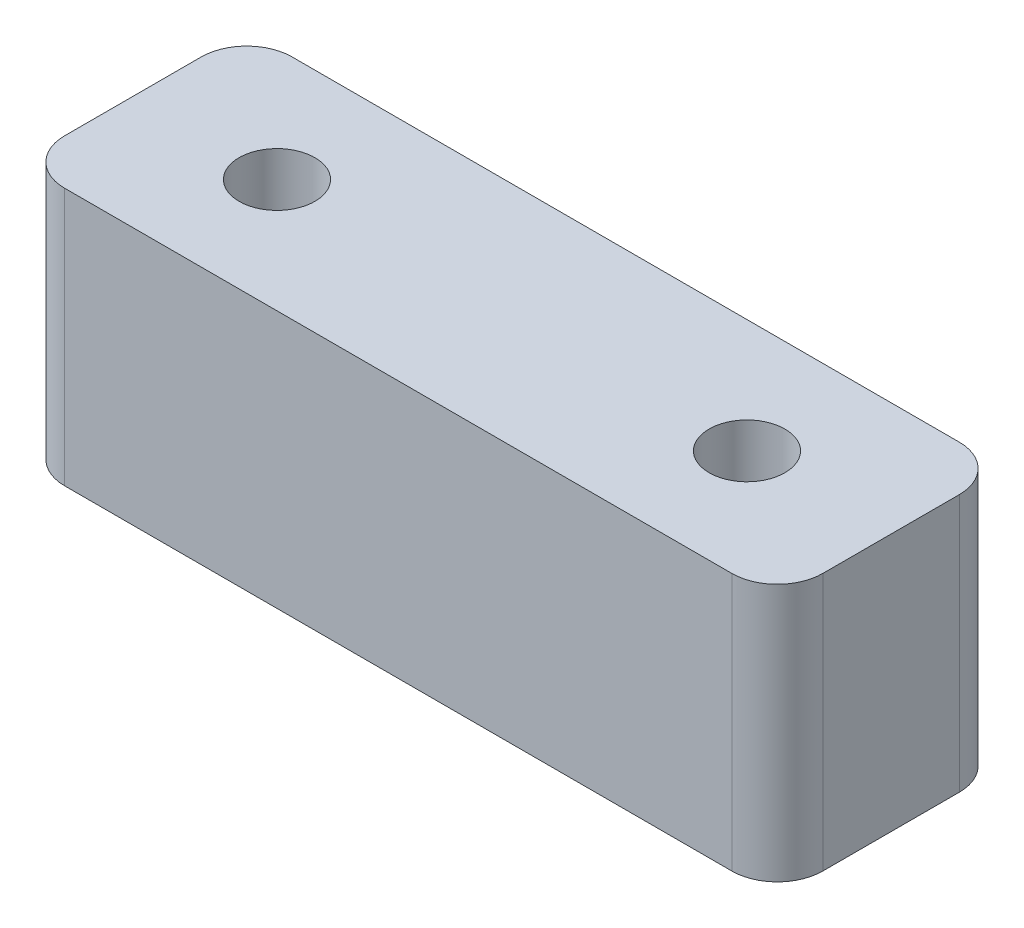
ISO-10303-21;
HEADER;
FILE_DESCRIPTION(('STEP AP214'),'2;1');
FILE_NAME('part.step','',(''),(''),'','','');
FILE_SCHEMA(('AUTOMOTIVE_DESIGN { 1 0 10303 214 1 1 1 1 }'));
ENDSEC;
DATA;
#1=APPLICATION_CONTEXT('core data for automotive mechanical design processes');
#2=APPLICATION_PROTOCOL_DEFINITION('international standard','automotive_design',2000,#1);
#3=PRODUCT_CONTEXT('',#1,'mechanical');
#4=PRODUCT('Part','Part','',(#3));
#5=PRODUCT_RELATED_PRODUCT_CATEGORY('part','',(#4));
#6=PRODUCT_DEFINITION_FORMATION('','',#4);
#7=PRODUCT_DEFINITION_CONTEXT('part definition',#1,'design');
#8=PRODUCT_DEFINITION('design','',#6,#7);
#9=PRODUCT_DEFINITION_SHAPE('','',#8);
#10=(LENGTH_UNIT() NAMED_UNIT(*) SI_UNIT(.MILLI.,.METRE.));
#11=(NAMED_UNIT(*) PLANE_ANGLE_UNIT() SI_UNIT($,.RADIAN.));
#12=(NAMED_UNIT(*) SI_UNIT($,.STERADIAN.) SOLID_ANGLE_UNIT());
#13=UNCERTAINTY_MEASURE_WITH_UNIT(LENGTH_MEASURE(1.E-05),#10,'distance_accuracy_value','');
#14=(GEOMETRIC_REPRESENTATION_CONTEXT(3) GLOBAL_UNCERTAINTY_ASSIGNED_CONTEXT((#13)) GLOBAL_UNIT_ASSIGNED_CONTEXT((#10,
#11,#12)) REPRESENTATION_CONTEXT('',''));
#15=CARTESIAN_POINT('',(0.,0.,0.));
#16=DIRECTION('',(0.,0.,1.));
#17=DIRECTION('',(1.,0.,0.));
#18=AXIS2_PLACEMENT_3D('',#15,#16,#17);
#19=CARTESIAN_POINT('',(3.,17.,-3.));
#20=DIRECTION('',(0.,1.,0.));
#21=DIRECTION('',(0.,0.,1.));
#22=AXIS2_PLACEMENT_3D('',#19,#20,#21);
#23=CYLINDRICAL_SURFACE('',#22,3.);
#24=DIRECTION('',(0.,1.,0.));
#25=VECTOR('',#24,1.);
#26=CARTESIAN_POINT('',(0.,17.,-3.));
#27=LINE('',#26,#25);
#28=CARTESIAN_POINT('',(0.,0.,-3.));
#29=VERTEX_POINT('',#28);
#30=CARTESIAN_POINT('',(0.,17.,-3.));
#31=VERTEX_POINT('',#30);
#32=EDGE_CURVE('E147',#29,#31,#27,.T.);
#33=ORIENTED_EDGE('',*,*,#32,.F.);
#34=CARTESIAN_POINT('',(3.,0.,-3.));
#35=DIRECTION('',(0.,-1.,0.));
#36=DIRECTION('',(0.,0.,-1.));
#37=AXIS2_PLACEMENT_3D('',#34,#35,#36);
#38=CIRCLE('',#37,3.);
#39=CARTESIAN_POINT('',(3.,0.,0.));
#40=VERTEX_POINT('',#39);
#41=EDGE_CURVE('E39',#40,#29,#38,.T.);
#42=ORIENTED_EDGE('',*,*,#41,.F.);
#43=DIRECTION('',(0.,1.,0.));
#44=VECTOR('',#43,1.);
#45=CARTESIAN_POINT('',(3.,17.,0.));
#46=LINE('',#45,#44);
#47=CARTESIAN_POINT('',(3.,17.,0.));
#48=VERTEX_POINT('',#47);
#49=EDGE_CURVE('E99',#48,#40,#46,.F.);
#50=ORIENTED_EDGE('',*,*,#49,.F.);
#51=CARTESIAN_POINT('',(3.,17.,-3.));
#52=DIRECTION('',(0.,-1.,0.));
#53=DIRECTION('',(0.,0.,-1.));
#54=AXIS2_PLACEMENT_3D('',#51,#52,#53);
#55=CIRCLE('',#54,3.);
#56=EDGE_CURVE('E11',#31,#48,#55,.F.);
#57=ORIENTED_EDGE('',*,*,#56,.F.);
#58=EDGE_LOOP('',(#33,#42,#50,#57));
#59=FACE_BOUND('',#58,.T.);
#60=ADVANCED_FACE('F32',(#59),#23,.T.);
#61=CARTESIAN_POINT('',(3.,17.,-12.));
#62=DIRECTION('',(0.,1.,0.));
#63=DIRECTION('',(0.,0.,1.));
#64=AXIS2_PLACEMENT_3D('',#61,#62,#63);
#65=CYLINDRICAL_SURFACE('',#64,3.);
#66=DIRECTION('',(0.,1.,0.));
#67=VECTOR('',#66,1.);
#68=CARTESIAN_POINT('',(3.,17.,-15.));
#69=LINE('',#68,#67);
#70=CARTESIAN_POINT('',(3.,0.,-15.));
#71=VERTEX_POINT('',#70);
#72=CARTESIAN_POINT('',(3.,17.,-15.));
#73=VERTEX_POINT('',#72);
#74=EDGE_CURVE('E137',#71,#73,#69,.T.);
#75=ORIENTED_EDGE('',*,*,#74,.F.);
#76=CARTESIAN_POINT('',(3.,0.,-12.));
#77=DIRECTION('',(0.,-1.,0.));
#78=DIRECTION('',(0.,0.,-1.));
#79=AXIS2_PLACEMENT_3D('',#76,#77,#78);
#80=CIRCLE('',#79,3.);
#81=CARTESIAN_POINT('',(0.,0.,-12.));
#82=VERTEX_POINT('',#81);
#83=EDGE_CURVE('E143',#82,#71,#80,.T.);
#84=ORIENTED_EDGE('',*,*,#83,.F.);
#85=DIRECTION('',(0.,1.,0.));
#86=VECTOR('',#85,1.);
#87=CARTESIAN_POINT('',(0.,17.,-12.));
#88=LINE('',#87,#86);
#89=CARTESIAN_POINT('',(0.,17.,-12.));
#90=VERTEX_POINT('',#89);
#91=EDGE_CURVE('E140',#90,#82,#88,.F.);
#92=ORIENTED_EDGE('',*,*,#91,.F.);
#93=CARTESIAN_POINT('',(3.,17.,-12.));
#94=DIRECTION('',(0.,-1.,0.));
#95=DIRECTION('',(0.,0.,-1.));
#96=AXIS2_PLACEMENT_3D('',#93,#94,#95);
#97=CIRCLE('',#96,3.);
#98=EDGE_CURVE('E145',#73,#90,#97,.F.);
#99=ORIENTED_EDGE('',*,*,#98,.F.);
#100=EDGE_LOOP('',(#75,#84,#92,#99));
#101=FACE_BOUND('',#100,.T.);
#102=ADVANCED_FACE('F183',(#101),#65,.T.);
#103=CARTESIAN_POINT('',(47.,17.,-12.));
#104=DIRECTION('',(0.,1.,0.));
#105=DIRECTION('',(0.,0.,1.));
#106=AXIS2_PLACEMENT_3D('',#103,#104,#105);
#107=CYLINDRICAL_SURFACE('',#106,3.);
#108=DIRECTION('',(0.,1.,0.));
#109=VECTOR('',#108,1.);
#110=CARTESIAN_POINT('',(50.,17.,-12.));
#111=LINE('',#110,#109);
#112=CARTESIAN_POINT('',(50.,0.,-12.));
#113=VERTEX_POINT('',#112);
#114=CARTESIAN_POINT('',(50.,17.,-12.));
#115=VERTEX_POINT('',#114);
#116=EDGE_CURVE('E127',#113,#115,#111,.T.);
#117=ORIENTED_EDGE('',*,*,#116,.F.);
#118=CARTESIAN_POINT('',(47.,0.,-12.));
#119=DIRECTION('',(0.,-1.,0.));
#120=DIRECTION('',(0.,0.,-1.));
#121=AXIS2_PLACEMENT_3D('',#118,#119,#120);
#122=CIRCLE('',#121,3.);
#123=CARTESIAN_POINT('',(47.,0.,-15.));
#124=VERTEX_POINT('',#123);
#125=EDGE_CURVE('E133',#124,#113,#122,.T.);
#126=ORIENTED_EDGE('',*,*,#125,.F.);
#127=DIRECTION('',(0.,1.,0.));
#128=VECTOR('',#127,1.);
#129=CARTESIAN_POINT('',(47.,17.,-15.));
#130=LINE('',#129,#128);
#131=CARTESIAN_POINT('',(47.,17.,-15.));
#132=VERTEX_POINT('',#131);
#133=EDGE_CURVE('E130',#132,#124,#130,.F.);
#134=ORIENTED_EDGE('',*,*,#133,.F.);
#135=CARTESIAN_POINT('',(47.,17.,-12.));
#136=DIRECTION('',(0.,-1.,0.));
#137=DIRECTION('',(0.,0.,-1.));
#138=AXIS2_PLACEMENT_3D('',#135,#136,#137);
#139=CIRCLE('',#138,3.);
#140=EDGE_CURVE('E135',#115,#132,#139,.F.);
#141=ORIENTED_EDGE('',*,*,#140,.F.);
#142=EDGE_LOOP('',(#117,#126,#134,#141));
#143=FACE_BOUND('',#142,.T.);
#144=ADVANCED_FACE('F178',(#143),#107,.T.);
#145=CARTESIAN_POINT('',(47.,17.,-3.));
#146=DIRECTION('',(0.,1.,0.));
#147=DIRECTION('',(0.,0.,1.));
#148=AXIS2_PLACEMENT_3D('',#145,#146,#147);
#149=CYLINDRICAL_SURFACE('',#148,3.);
#150=DIRECTION('',(0.,1.,0.));
#151=VECTOR('',#150,1.);
#152=CARTESIAN_POINT('',(47.,17.,0.));
#153=LINE('',#152,#151);
#154=CARTESIAN_POINT('',(47.,0.,0.));
#155=VERTEX_POINT('',#154);
#156=CARTESIAN_POINT('',(47.,17.,0.));
#157=VERTEX_POINT('',#156);
#158=EDGE_CURVE('E98',#155,#157,#153,.T.);
#159=ORIENTED_EDGE('',*,*,#158,.F.);
#160=CARTESIAN_POINT('',(47.,0.,-3.));
#161=DIRECTION('',(0.,-1.,0.));
#162=DIRECTION('',(0.,0.,-1.));
#163=AXIS2_PLACEMENT_3D('',#160,#161,#162);
#164=CIRCLE('',#163,3.);
#165=CARTESIAN_POINT('',(50.,0.,-3.));
#166=VERTEX_POINT('',#165);
#167=EDGE_CURVE('E105',#166,#155,#164,.T.);
#168=ORIENTED_EDGE('',*,*,#167,.F.);
#169=DIRECTION('',(0.,1.,0.));
#170=VECTOR('',#169,1.);
#171=CARTESIAN_POINT('',(50.,17.,-3.));
#172=LINE('',#171,#170);
#173=CARTESIAN_POINT('',(50.,17.,-3.));
#174=VERTEX_POINT('',#173);
#175=EDGE_CURVE('E112',#174,#166,#172,.F.);
#176=ORIENTED_EDGE('',*,*,#175,.F.);
#177=CARTESIAN_POINT('',(47.,17.,-3.));
#178=DIRECTION('',(0.,-1.,0.));
#179=DIRECTION('',(0.,0.,-1.));
#180=AXIS2_PLACEMENT_3D('',#177,#178,#179);
#181=CIRCLE('',#180,3.);
#182=EDGE_CURVE('E111',#157,#174,#181,.F.);
#183=ORIENTED_EDGE('',*,*,#182,.F.);
#184=EDGE_LOOP('',(#159,#168,#176,#183));
#185=FACE_BOUND('',#184,.T.);
#186=ADVANCED_FACE('F115',(#185),#149,.T.);
#187=CARTESIAN_POINT('',(0.,17.,0.));
#188=DIRECTION('',(1.,0.,0.));
#189=DIRECTION('',(0.,0.,-1.));
#190=AXIS2_PLACEMENT_3D('',#187,#188,#189);
#191=PLANE('',#190);
#192=DIRECTION('',(0.,0.,1.));
#193=VECTOR('',#192,1.);
#194=CARTESIAN_POINT('',(0.,0.,0.));
#195=LINE('',#194,#193);
#196=EDGE_CURVE('E102',#82,#29,#195,.T.);
#197=ORIENTED_EDGE('',*,*,#196,.T.);
#198=ORIENTED_EDGE('',*,*,#32,.T.);
#199=DIRECTION('',(0.,0.,1.));
#200=VECTOR('',#199,1.);
#201=CARTESIAN_POINT('',(0.,17.,0.));
#202=LINE('',#201,#200);
#203=EDGE_CURVE('E164',#90,#31,#202,.T.);
#204=ORIENTED_EDGE('',*,*,#203,.F.);
#205=ORIENTED_EDGE('',*,*,#91,.T.);
#206=EDGE_LOOP('',(#197,#198,#204,#205));
#207=FACE_BOUND('',#206,.T.);
#208=ADVANCED_FACE('F154',(#207),#191,.F.);
#209=CARTESIAN_POINT('',(0.,17.,0.));
#210=DIRECTION('',(0.,0.,-1.));
#211=DIRECTION('',(-1.,0.,0.));
#212=AXIS2_PLACEMENT_3D('',#209,#210,#211);
#213=PLANE('',#212);
#214=DIRECTION('',(1.,0.,0.));
#215=VECTOR('',#214,1.);
#216=CARTESIAN_POINT('',(0.,17.,0.));
#217=LINE('',#216,#215);
#218=EDGE_CURVE('E167',#48,#157,#217,.T.);
#219=ORIENTED_EDGE('',*,*,#218,.F.);
#220=ORIENTED_EDGE('',*,*,#49,.T.);
#221=DIRECTION('',(1.,0.,0.));
#222=VECTOR('',#221,1.);
#223=CARTESIAN_POINT('',(0.,0.,0.));
#224=LINE('',#223,#222);
#225=EDGE_CURVE('E93',#40,#155,#224,.T.);
#226=ORIENTED_EDGE('',*,*,#225,.T.);
#227=ORIENTED_EDGE('',*,*,#158,.T.);
#228=EDGE_LOOP('',(#219,#220,#226,#227));
#229=FACE_BOUND('',#228,.T.);
#230=ADVANCED_FACE('F96',(#229),#213,.F.);
#231=CARTESIAN_POINT('',(50.,17.,0.));
#232=DIRECTION('',(-1.,0.,0.));
#233=DIRECTION('',(0.,0.,1.));
#234=AXIS2_PLACEMENT_3D('',#231,#232,#233);
#235=PLANE('',#234);
#236=DIRECTION('',(0.,0.,-1.));
#237=VECTOR('',#236,1.);
#238=CARTESIAN_POINT('',(50.,0.,0.));
#239=LINE('',#238,#237);
#240=EDGE_CURVE('E101',#166,#113,#239,.T.);
#241=ORIENTED_EDGE('',*,*,#240,.T.);
#242=ORIENTED_EDGE('',*,*,#116,.T.);
#243=DIRECTION('',(0.,0.,-1.));
#244=VECTOR('',#243,1.);
#245=CARTESIAN_POINT('',(50.,17.,0.));
#246=LINE('',#245,#244);
#247=EDGE_CURVE('E120',#174,#115,#246,.T.);
#248=ORIENTED_EDGE('',*,*,#247,.F.);
#249=ORIENTED_EDGE('',*,*,#175,.T.);
#250=EDGE_LOOP('',(#241,#242,#248,#249));
#251=FACE_BOUND('',#250,.T.);
#252=ADVANCED_FACE('F175',(#251),#235,.F.);
#253=CARTESIAN_POINT('',(0.,17.,-15.));
#254=DIRECTION('',(0.,0.,1.));
#255=DIRECTION('',(1.,0.,0.));
#256=AXIS2_PLACEMENT_3D('',#253,#254,#255);
#257=PLANE('',#256);
#258=DIRECTION('',(-1.,0.,0.));
#259=VECTOR('',#258,1.);
#260=CARTESIAN_POINT('',(0.,0.,-15.));
#261=LINE('',#260,#259);
#262=EDGE_CURVE('E123',#124,#71,#261,.T.);
#263=ORIENTED_EDGE('',*,*,#262,.T.);
#264=ORIENTED_EDGE('',*,*,#74,.T.);
#265=DIRECTION('',(-1.,0.,0.));
#266=VECTOR('',#265,1.);
#267=CARTESIAN_POINT('',(0.,17.,-15.));
#268=LINE('',#267,#266);
#269=EDGE_CURVE('E116',#132,#73,#268,.T.);
#270=ORIENTED_EDGE('',*,*,#269,.F.);
#271=ORIENTED_EDGE('',*,*,#133,.T.);
#272=EDGE_LOOP('',(#263,#264,#270,#271));
#273=FACE_BOUND('',#272,.T.);
#274=ADVANCED_FACE('F180',(#273),#257,.F.);
#275=CARTESIAN_POINT('',(0.,17.,0.));
#276=DIRECTION('',(0.,-1.,0.));
#277=DIRECTION('',(0.,0.,-1.));
#278=AXIS2_PLACEMENT_3D('',#275,#276,#277);
#279=PLANE('',#278);
#280=CARTESIAN_POINT('',(9.5,17.,-7.5));
#281=DIRECTION('',(0.,1.,0.));
#282=DIRECTION('',(0.,0.,1.));
#283=AXIS2_PLACEMENT_3D('',#280,#281,#282);
#284=CIRCLE('',#283,2.5);
#285=CARTESIAN_POINT('',(9.5,17.,-5.));
#286=VERTEX_POINT('',#285);
#287=EDGE_CURVE('E222',#286,#286,#284,.T.);
#288=ORIENTED_EDGE('',*,*,#287,.F.);
#289=EDGE_LOOP('',(#288));
#290=FACE_BOUND('',#289,.T.);
#291=CARTESIAN_POINT('',(40.5,17.,-7.5));
#292=DIRECTION('',(0.,1.,0.));
#293=DIRECTION('',(0.,0.,1.));
#294=AXIS2_PLACEMENT_3D('',#291,#292,#293);
#295=CIRCLE('',#294,2.5);
#296=CARTESIAN_POINT('',(40.5,17.,-5.));
#297=VERTEX_POINT('',#296);
#298=EDGE_CURVE('E159',#297,#297,#295,.T.);
#299=ORIENTED_EDGE('',*,*,#298,.F.);
#300=EDGE_LOOP('',(#299));
#301=FACE_BOUND('',#300,.T.);
#302=ORIENTED_EDGE('',*,*,#203,.T.);
#303=ORIENTED_EDGE('',*,*,#56,.T.);
#304=ORIENTED_EDGE('',*,*,#218,.T.);
#305=ORIENTED_EDGE('',*,*,#182,.T.);
#306=ORIENTED_EDGE('',*,*,#247,.T.);
#307=ORIENTED_EDGE('',*,*,#140,.T.);
#308=ORIENTED_EDGE('',*,*,#269,.T.);
#309=ORIENTED_EDGE('',*,*,#98,.T.);
#310=EDGE_LOOP('',(#302,#303,#304,#305,#306,#307,#308,#309));
#311=FACE_BOUND('',#310,.T.);
#312=ADVANCED_FACE('F173',(#290,#301,#311),#279,.F.);
#313=CARTESIAN_POINT('',(0.,0.,0.));
#314=DIRECTION('',(0.,-1.,0.));
#315=DIRECTION('',(0.,0.,-1.));
#316=AXIS2_PLACEMENT_3D('',#313,#314,#315);
#317=PLANE('',#316);
#318=CARTESIAN_POINT('',(9.5,0.,-7.5));
#319=DIRECTION('',(0.,1.,0.));
#320=DIRECTION('',(0.,0.,1.));
#321=AXIS2_PLACEMENT_3D('',#318,#319,#320);
#322=CIRCLE('',#321,2.5);
#323=CARTESIAN_POINT('',(9.5,0.,-5.));
#324=VERTEX_POINT('',#323);
#325=EDGE_CURVE('E219',#324,#324,#322,.T.);
#326=ORIENTED_EDGE('',*,*,#325,.T.);
#327=EDGE_LOOP('',(#326));
#328=FACE_BOUND('',#327,.T.);
#329=CARTESIAN_POINT('',(40.5,0.,-7.5));
#330=DIRECTION('',(0.,1.,0.));
#331=DIRECTION('',(0.,0.,1.));
#332=AXIS2_PLACEMENT_3D('',#329,#330,#331);
#333=CIRCLE('',#332,2.5);
#334=CARTESIAN_POINT('',(40.5,0.,-5.));
#335=VERTEX_POINT('',#334);
#336=EDGE_CURVE('E156',#335,#335,#333,.T.);
#337=ORIENTED_EDGE('',*,*,#336,.T.);
#338=EDGE_LOOP('',(#337));
#339=FACE_BOUND('',#338,.T.);
#340=ORIENTED_EDGE('',*,*,#225,.F.);
#341=ORIENTED_EDGE('',*,*,#41,.T.);
#342=ORIENTED_EDGE('',*,*,#196,.F.);
#343=ORIENTED_EDGE('',*,*,#83,.T.);
#344=ORIENTED_EDGE('',*,*,#262,.F.);
#345=ORIENTED_EDGE('',*,*,#125,.T.);
#346=ORIENTED_EDGE('',*,*,#240,.F.);
#347=ORIENTED_EDGE('',*,*,#167,.T.);
#348=EDGE_LOOP('',(#340,#341,#342,#343,#344,#345,#346,#347));
#349=FACE_BOUND('',#348,.T.);
#350=ADVANCED_FACE('F106',(#328,#339,#349),#317,.T.);
#351=CARTESIAN_POINT('',(40.5,0.,-7.5));
#352=DIRECTION('',(0.,1.,0.));
#353=DIRECTION('',(0.,0.,1.));
#354=AXIS2_PLACEMENT_3D('',#351,#352,#353);
#355=CYLINDRICAL_SURFACE('',#354,2.5);
#356=ORIENTED_EDGE('',*,*,#336,.F.);
#357=EDGE_LOOP('',(#356));
#358=FACE_BOUND('',#357,.T.);
#359=ORIENTED_EDGE('',*,*,#298,.T.);
#360=EDGE_LOOP('',(#359));
#361=FACE_BOUND('',#360,.T.);
#362=ADVANCED_FACE('F203',(#358,#361),#355,.F.);
#363=CARTESIAN_POINT('',(9.5,0.,-7.5));
#364=DIRECTION('',(0.,1.,0.));
#365=DIRECTION('',(0.,0.,1.));
#366=AXIS2_PLACEMENT_3D('',#363,#364,#365);
#367=CYLINDRICAL_SURFACE('',#366,2.5);
#368=ORIENTED_EDGE('',*,*,#325,.F.);
#369=EDGE_LOOP('',(#368));
#370=FACE_BOUND('',#369,.T.);
#371=ORIENTED_EDGE('',*,*,#287,.T.);
#372=EDGE_LOOP('',(#371));
#373=FACE_BOUND('',#372,.T.);
#374=ADVANCED_FACE('F210',(#370,#373),#367,.F.);
#375=CLOSED_SHELL('',(#60,#102,#144,#186,#208,#230,#252,#274,#312,#350,#362,#374));
#376=MANIFOLD_SOLID_BREP('B2',#375);
#377=ADVANCED_BREP_SHAPE_REPRESENTATION('',(#18,#376),#14);
#378=SHAPE_DEFINITION_REPRESENTATION(#9,#377);
ENDSEC;
END-ISO-10303-21;
